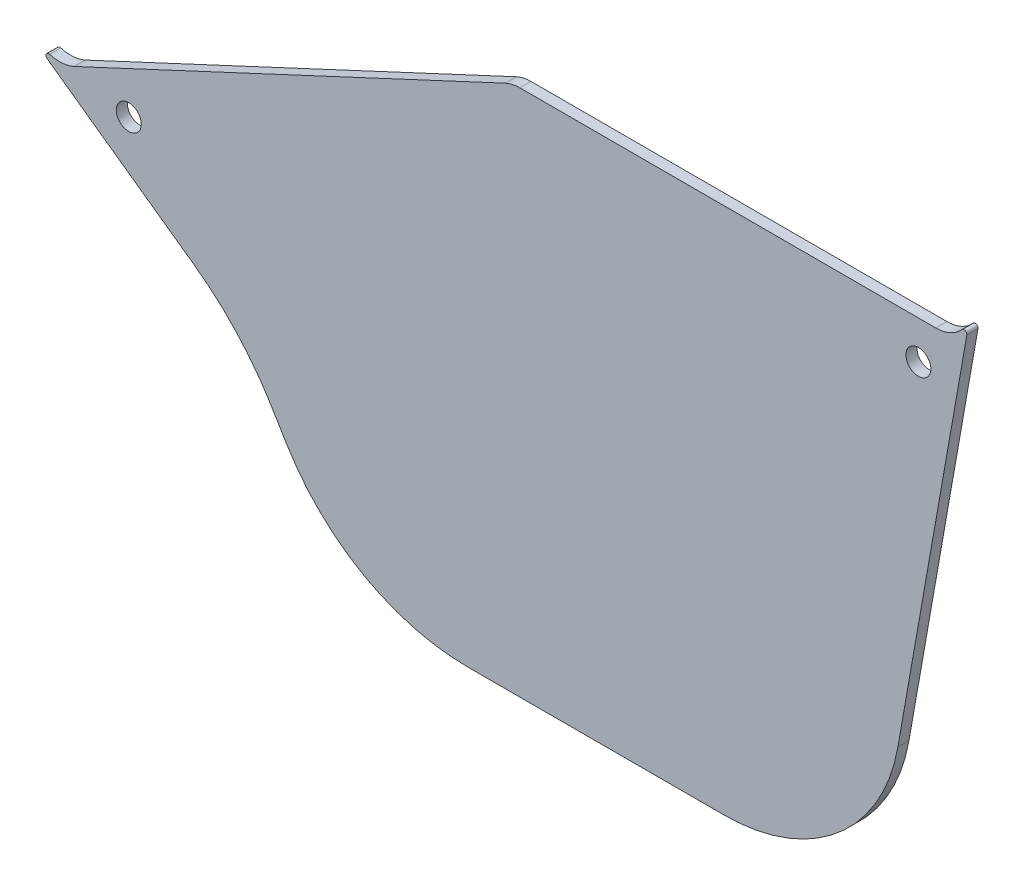
ISO-10303-21;
HEADER;
FILE_DESCRIPTION(('STEP AP214'),'2;1');
FILE_NAME('part.step','',(''),(''),'','','');
FILE_SCHEMA(('AUTOMOTIVE_DESIGN { 1 0 10303 214 1 1 1 1 }'));
ENDSEC;
DATA;
#1=APPLICATION_CONTEXT('core data for automotive mechanical design processes');
#2=APPLICATION_PROTOCOL_DEFINITION('international standard','automotive_design',2000,#1);
#3=PRODUCT_CONTEXT('',#1,'mechanical');
#4=PRODUCT('Part','Part','',(#3));
#5=PRODUCT_RELATED_PRODUCT_CATEGORY('part','',(#4));
#6=PRODUCT_DEFINITION_FORMATION('','',#4);
#7=PRODUCT_DEFINITION_CONTEXT('part definition',#1,'design');
#8=PRODUCT_DEFINITION('design','',#6,#7);
#9=PRODUCT_DEFINITION_SHAPE('','',#8);
#10=(LENGTH_UNIT() NAMED_UNIT(*) SI_UNIT(.MILLI.,.METRE.));
#11=(NAMED_UNIT(*) PLANE_ANGLE_UNIT() SI_UNIT($,.RADIAN.));
#12=(NAMED_UNIT(*) SI_UNIT($,.STERADIAN.) SOLID_ANGLE_UNIT());
#13=UNCERTAINTY_MEASURE_WITH_UNIT(LENGTH_MEASURE(1.E-05),#10,'distance_accuracy_value','');
#14=(GEOMETRIC_REPRESENTATION_CONTEXT(3) GLOBAL_UNCERTAINTY_ASSIGNED_CONTEXT((#13)) GLOBAL_UNIT_ASSIGNED_CONTEXT((#10,
#11,#12)) REPRESENTATION_CONTEXT('',''));
#15=CARTESIAN_POINT('',(0.,0.,0.));
#16=DIRECTION('',(0.,0.,1.));
#17=DIRECTION('',(1.,0.,0.));
#18=AXIS2_PLACEMENT_3D('',#15,#16,#17);
#19=CARTESIAN_POINT('',(3.17555102702063,-3.48237513143359,-2.3));
#20=DIRECTION('',(0.,0.,-1.));
#21=DIRECTION('',(-1.,0.,0.));
#22=AXIS2_PLACEMENT_3D('',#19,#20,#21);
#23=CYLINDRICAL_SURFACE('',#22,6.29662486856644);
#24=CARTESIAN_POINT('',(3.17555102702063,-3.48237513143359,-2.3));
#25=DIRECTION('',(0.,0.,1.));
#26=DIRECTION('',(1.,0.,0.));
#27=AXIS2_PLACEMENT_3D('',#24,#25,#26);
#28=CIRCLE('',#27,6.29662486856644);
#29=CARTESIAN_POINT('',(3.17555102702063,-9.77900000000003,-2.3));
#30=VERTEX_POINT('',#29);
#31=CARTESIAN_POINT('',(7.87588451477191,-7.6721662765115,-2.3));
#32=VERTEX_POINT('',#31);
#33=EDGE_CURVE('E147',#30,#32,#28,.T.);
#34=ORIENTED_EDGE('',*,*,#33,.T.);
#35=DIRECTION('',(0.,0.,-1.));
#36=VECTOR('',#35,1.);
#37=CARTESIAN_POINT('',(7.87588451477191,-7.6721662765115,-2.3));
#38=LINE('',#37,#36);
#39=CARTESIAN_POINT('',(7.87588451477191,-7.6721662765115,-4.3));
#40=VERTEX_POINT('',#39);
#41=EDGE_CURVE('E46',#32,#40,#38,.T.);
#42=ORIENTED_EDGE('',*,*,#41,.T.);
#43=CARTESIAN_POINT('',(3.17555102702063,-3.48237513143359,-4.3));
#44=DIRECTION('',(0.,0.,1.));
#45=DIRECTION('',(1.,0.,0.));
#46=AXIS2_PLACEMENT_3D('',#43,#44,#45);
#47=CIRCLE('',#46,6.29662486856644);
#48=CARTESIAN_POINT('',(3.17555102702063,-9.77900000000003,-4.3));
#49=VERTEX_POINT('',#48);
#50=EDGE_CURVE('E150',#49,#40,#47,.T.);
#51=ORIENTED_EDGE('',*,*,#50,.F.);
#52=DIRECTION('',(0.,0.,-1.));
#53=VECTOR('',#52,1.);
#54=CARTESIAN_POINT('',(3.17555102702063,-9.77900000000003,-2.3));
#55=LINE('',#54,#53);
#56=EDGE_CURVE('E145',#30,#49,#55,.T.);
#57=ORIENTED_EDGE('',*,*,#56,.F.);
#58=EDGE_LOOP('',(#34,#42,#51,#57));
#59=FACE_BOUND('',#58,.T.);
#60=ADVANCED_FACE('F38',(#59),#23,.F.);
#61=CARTESIAN_POINT('',(0.,-9.77900000000003,-2.3));
#62=DIRECTION('',(0.,1.,0.));
#63=DIRECTION('',(0.,0.,1.));
#64=AXIS2_PLACEMENT_3D('',#61,#62,#63);
#65=PLANE('',#64);
#66=DIRECTION('',(1.,0.,0.));
#67=VECTOR('',#66,1.);
#68=CARTESIAN_POINT('',(0.,-9.77900000000003,-4.3));
#69=LINE('',#68,#67);
#70=CARTESIAN_POINT('',(-71.7349422918853,-9.77900000000003,-4.3));
#71=VERTEX_POINT('',#70);
#72=EDGE_CURVE('E200',#71,#49,#69,.T.);
#73=ORIENTED_EDGE('',*,*,#72,.F.);
#74=DIRECTION('',(0.,0.,-1.));
#75=VECTOR('',#74,1.);
#76=CARTESIAN_POINT('',(-71.7349422918853,-9.77900000000003,-2.3));
#77=LINE('',#76,#75);
#78=CARTESIAN_POINT('',(-71.7349422918853,-9.77900000000003,-2.3));
#79=VERTEX_POINT('',#78);
#80=EDGE_CURVE('E156',#79,#71,#77,.T.);
#81=ORIENTED_EDGE('',*,*,#80,.F.);
#82=DIRECTION('',(1.,0.,0.));
#83=VECTOR('',#82,1.);
#84=CARTESIAN_POINT('',(0.,-9.77900000000003,-2.3));
#85=LINE('',#84,#83);
#86=EDGE_CURVE('E162',#79,#30,#85,.T.);
#87=ORIENTED_EDGE('',*,*,#86,.T.);
#88=ORIENTED_EDGE('',*,*,#56,.T.);
#89=EDGE_LOOP('',(#73,#81,#87,#88));
#90=FACE_BOUND('',#89,.T.);
#91=ADVANCED_FACE('F165',(#90),#65,.T.);
#92=CARTESIAN_POINT('',(-71.7349422918853,-15.875,-2.3));
#93=DIRECTION('',(0.,0.,-1.));
#94=DIRECTION('',(-1.,0.,0.));
#95=AXIS2_PLACEMENT_3D('',#92,#93,#94);
#96=CYLINDRICAL_SURFACE('',#95,6.096);
#97=CARTESIAN_POINT('',(-71.7349422918853,-15.875,-4.3));
#98=DIRECTION('',(0.,0.,1.));
#99=DIRECTION('',(1.,0.,0.));
#100=AXIS2_PLACEMENT_3D('',#97,#98,#99);
#101=CIRCLE('',#100,6.096);
#102=CARTESIAN_POINT('',(-74.3118353761856,-10.3504332267511,-4.3));
#103=VERTEX_POINT('',#102);
#104=EDGE_CURVE('E202',#71,#103,#101,.T.);
#105=ORIENTED_EDGE('',*,*,#104,.T.);
#106=DIRECTION('',(0.,0.,-1.));
#107=VECTOR('',#106,1.);
#108=CARTESIAN_POINT('',(-74.3118353761856,-10.3504332267511,-2.3));
#109=LINE('',#108,#107);
#110=CARTESIAN_POINT('',(-74.3118353761856,-10.3504332267511,-2.3));
#111=VERTEX_POINT('',#110);
#112=EDGE_CURVE('E254',#111,#103,#109,.T.);
#113=ORIENTED_EDGE('',*,*,#112,.F.);
#114=CARTESIAN_POINT('',(-71.7349422918853,-15.875,-2.3));
#115=DIRECTION('',(0.,0.,1.));
#116=DIRECTION('',(1.,0.,0.));
#117=AXIS2_PLACEMENT_3D('',#114,#115,#116);
#118=CIRCLE('',#117,6.096);
#119=EDGE_CURVE('E167',#79,#111,#118,.T.);
#120=ORIENTED_EDGE('',*,*,#119,.F.);
#121=ORIENTED_EDGE('',*,*,#80,.T.);
#122=EDGE_LOOP('',(#105,#113,#120,#121));
#123=FACE_BOUND('',#122,.T.);
#124=ADVANCED_FACE('F277',(#123),#96,.T.);
#125=CARTESIAN_POINT('',(-9.3136793879501,19.9674732323381,-2.3));
#126=DIRECTION('',(-0.422718681807782,0.906260953616943,0.));
#127=DIRECTION('',(-0.906260953616943,-0.422718681807782,0.));
#128=AXIS2_PLACEMENT_3D('',#125,#126,#127);
#129=PLANE('',#128);
#130=DIRECTION('',(0.906260953616943,0.422718681807782,0.));
#131=VECTOR('',#130,1.);
#132=CARTESIAN_POINT('',(-9.3136793879501,19.9674732323381,-4.3));
#133=LINE('',#132,#131);
#134=CARTESIAN_POINT('',(-151.921287836726,-46.5507851331294,-4.3));
#135=VERTEX_POINT('',#134);
#136=EDGE_CURVE('E205',#135,#103,#133,.T.);
#137=ORIENTED_EDGE('',*,*,#136,.F.);
#138=DIRECTION('',(0.,0.,-1.));
#139=VECTOR('',#138,1.);
#140=CARTESIAN_POINT('',(-151.921287836726,-46.5507851331294,-2.3));
#141=LINE('',#140,#139);
#142=CARTESIAN_POINT('',(-151.921287836726,-46.5507851331294,-2.3));
#143=VERTEX_POINT('',#142);
#144=EDGE_CURVE('E251',#143,#135,#141,.T.);
#145=ORIENTED_EDGE('',*,*,#144,.F.);
#146=DIRECTION('',(0.906260953616943,0.422718681807782,0.));
#147=VECTOR('',#146,1.);
#148=CARTESIAN_POINT('',(-9.3136793879501,19.9674732323381,-2.3));
#149=LINE('',#148,#147);
#150=EDGE_CURVE('E169',#143,#111,#149,.T.);
#151=ORIENTED_EDGE('',*,*,#150,.T.);
#152=ORIENTED_EDGE('',*,*,#112,.T.);
#153=EDGE_LOOP('',(#137,#145,#151,#152));
#154=FACE_BOUND('',#153,.T.);
#155=ADVANCED_FACE('F282',(#154),#129,.T.);
#156=CARTESIAN_POINT('',(-154.579277370173,-40.8523567623182,-2.3));
#157=DIRECTION('',(0.,0.,-1.));
#158=DIRECTION('',(-1.,0.,0.));
#159=AXIS2_PLACEMENT_3D('',#156,#157,#158);
#160=CYLINDRICAL_SURFACE('',#159,6.28784496128673);
#161=CARTESIAN_POINT('',(-154.579277370173,-40.8523567623182,-4.3));
#162=DIRECTION('',(0.,0.,1.));
#163=DIRECTION('',(1.,0.,0.));
#164=AXIS2_PLACEMENT_3D('',#161,#162,#163);
#165=CIRCLE('',#164,6.28784496128673);
#166=CARTESIAN_POINT('',(-156.37458568513,-46.8784551942577,-4.3));
#167=VERTEX_POINT('',#166);
#168=EDGE_CURVE('E208',#167,#135,#165,.T.);
#169=ORIENTED_EDGE('',*,*,#168,.F.);
#170=DIRECTION('',(0.,0.,-1.));
#171=VECTOR('',#170,1.);
#172=CARTESIAN_POINT('',(-156.37458568513,-46.8784551942577,-2.3));
#173=LINE('',#172,#171);
#174=CARTESIAN_POINT('',(-156.37458568513,-46.8784551942577,-2.3));
#175=VERTEX_POINT('',#174);
#176=EDGE_CURVE('E263',#167,#175,#173,.F.);
#177=ORIENTED_EDGE('',*,*,#176,.T.);
#178=CARTESIAN_POINT('',(-154.579277370173,-40.8523567623182,-2.3));
#179=DIRECTION('',(0.,0.,1.));
#180=DIRECTION('',(1.,0.,0.));
#181=AXIS2_PLACEMENT_3D('',#178,#179,#180);
#182=CIRCLE('',#181,6.28784496128673);
#183=EDGE_CURVE('E174',#175,#143,#182,.T.);
#184=ORIENTED_EDGE('',*,*,#183,.T.);
#185=ORIENTED_EDGE('',*,*,#144,.T.);
#186=EDGE_LOOP('',(#169,#177,#184,#185));
#187=FACE_BOUND('',#186,.T.);
#188=ADVANCED_FACE('F285',(#187),#160,.F.);
#189=CARTESIAN_POINT('',(-148.894628576094,-37.8519380941255,-2.3));
#190=DIRECTION('',(0.,0.,-1.));
#191=DIRECTION('',(-1.,0.,0.));
#192=AXIS2_PLACEMENT_3D('',#189,#190,#191);
#193=CYLINDRICAL_SURFACE('',#192,12.7);
#194=CARTESIAN_POINT('',(-148.894628576094,-37.8519380941255,-2.3));
#195=DIRECTION('',(0.,0.,1.));
#196=DIRECTION('',(1.,0.,0.));
#197=AXIS2_PLACEMENT_3D('',#194,#195,#196);
#198=CIRCLE('',#197,12.7);
#199=CARTESIAN_POINT('',(-156.837338468798,-47.761698916685,-2.3));
#200=VERTEX_POINT('',#199);
#201=CARTESIAN_POINT('',(-156.273248148591,-48.188570679468,-2.3));
#202=VERTEX_POINT('',#201);
#203=EDGE_CURVE('E176',#200,#202,#198,.T.);
#204=ORIENTED_EDGE('',*,*,#203,.F.);
#205=DIRECTION('',(0.,0.,-1.));
#206=VECTOR('',#205,1.);
#207=CARTESIAN_POINT('',(-156.837338468798,-47.761698916685,-2.3));
#208=LINE('',#207,#206);
#209=CARTESIAN_POINT('',(-156.837338468798,-47.761698916685,-4.3));
#210=VERTEX_POINT('',#209);
#211=EDGE_CURVE('E155',#200,#210,#208,.T.);
#212=ORIENTED_EDGE('',*,*,#211,.T.);
#213=CARTESIAN_POINT('',(-148.894628576094,-37.8519380941255,-4.3));
#214=DIRECTION('',(0.,0.,1.));
#215=DIRECTION('',(1.,0.,0.));
#216=AXIS2_PLACEMENT_3D('',#213,#214,#215);
#217=CIRCLE('',#216,12.7);
#218=CARTESIAN_POINT('',(-156.273248148591,-48.188570679468,-4.3));
#219=VERTEX_POINT('',#218);
#220=EDGE_CURVE('E210',#210,#219,#217,.T.);
#221=ORIENTED_EDGE('',*,*,#220,.T.);
#222=DIRECTION('',(0.,0.,-1.));
#223=VECTOR('',#222,1.);
#224=CARTESIAN_POINT('',(-156.273248148591,-48.188570679468,-2.3));
#225=LINE('',#224,#223);
#226=EDGE_CURVE('E248',#202,#219,#225,.T.);
#227=ORIENTED_EDGE('',*,*,#226,.F.);
#228=EDGE_LOOP('',(#204,#212,#221,#227));
#229=FACE_BOUND('',#228,.T.);
#230=ADVANCED_FACE('F293',(#229),#193,.T.);
#231=CARTESIAN_POINT('',(-75.5377954413739,-105.820123955786,-2.3));
#232=DIRECTION('',(0.580993667125757,0.813908077586016,0.));
#233=DIRECTION('',(-0.813908077586016,0.580993667125757,0.));
#234=AXIS2_PLACEMENT_3D('',#231,#232,#233);
#235=PLANE('',#234);
#236=DIRECTION('',(0.813908077586016,-0.580993667125757,0.));
#237=VECTOR('',#236,1.);
#238=CARTESIAN_POINT('',(-75.5377954413739,-105.820123955786,-4.3));
#239=LINE('',#238,#237);
#240=CARTESIAN_POINT('',(-130.476004778937,-66.6034696586304,-4.3));
#241=VERTEX_POINT('',#240);
#242=EDGE_CURVE('E212',#219,#241,#239,.T.);
#243=ORIENTED_EDGE('',*,*,#242,.T.);
#244=DIRECTION('',(0.,0.,-1.));
#245=VECTOR('',#244,1.);
#246=CARTESIAN_POINT('',(-130.476004778937,-66.6034696586304,-2.3));
#247=LINE('',#246,#245);
#248=CARTESIAN_POINT('',(-130.476004778937,-66.6034696586304,-2.3));
#249=VERTEX_POINT('',#248);
#250=EDGE_CURVE('E245',#249,#241,#247,.T.);
#251=ORIENTED_EDGE('',*,*,#250,.F.);
#252=DIRECTION('',(0.813908077586016,-0.580993667125757,0.));
#253=VECTOR('',#252,1.);
#254=CARTESIAN_POINT('',(-75.5377954413739,-105.820123955786,-2.3));
#255=LINE('',#254,#253);
#256=EDGE_CURVE('E178',#202,#249,#255,.T.);
#257=ORIENTED_EDGE('',*,*,#256,.F.);
#258=ORIENTED_EDGE('',*,*,#226,.T.);
#259=EDGE_LOOP('',(#243,#251,#257,#258));
#260=FACE_BOUND('',#259,.T.);
#261=ADVANCED_FACE('F298',(#260),#235,.F.);
#262=CARTESIAN_POINT('',(-159.990483068926,-107.95,-2.3));
#263=DIRECTION('',(0.,0.,-1.));
#264=DIRECTION('',(-1.,0.,0.));
#265=AXIS2_PLACEMENT_3D('',#262,#263,#264);
#266=CYLINDRICAL_SURFACE('',#265,50.8);
#267=CARTESIAN_POINT('',(-159.990483068926,-107.95,-4.3));
#268=DIRECTION('',(0.,0.,1.));
#269=DIRECTION('',(1.,0.,0.));
#270=AXIS2_PLACEMENT_3D('',#267,#268,#269);
#271=CIRCLE('',#270,50.8);
#272=CARTESIAN_POINT('',(-116.540360393734,-81.6302956036583,-4.3));
#273=VERTEX_POINT('',#272);
#274=EDGE_CURVE('E214',#241,#273,#271,.F.);
#275=ORIENTED_EDGE('',*,*,#274,.T.);
#276=DIRECTION('',(0.,0.,-1.));
#277=VECTOR('',#276,1.);
#278=CARTESIAN_POINT('',(-116.540360393734,-81.6302956036583,-2.3));
#279=LINE('',#278,#277);
#280=CARTESIAN_POINT('',(-116.540360393734,-81.6302956036583,-2.3));
#281=VERTEX_POINT('',#280);
#282=EDGE_CURVE('E242',#281,#273,#279,.T.);
#283=ORIENTED_EDGE('',*,*,#282,.F.);
#284=CARTESIAN_POINT('',(-159.990483068926,-107.95,-2.3));
#285=DIRECTION('',(0.,0.,1.));
#286=DIRECTION('',(1.,0.,0.));
#287=AXIS2_PLACEMENT_3D('',#284,#285,#286);
#288=CIRCLE('',#287,50.8);
#289=EDGE_CURVE('E180',#249,#281,#288,.F.);
#290=ORIENTED_EDGE('',*,*,#289,.F.);
#291=ORIENTED_EDGE('',*,*,#250,.T.);
#292=EDGE_LOOP('',(#275,#283,#290,#291));
#293=FACE_BOUND('',#292,.T.);
#294=ADVANCED_FACE('F304',(#293),#266,.F.);
#295=CARTESIAN_POINT('',(-121.431128633614,-73.55632650436,-2.3));
#296=DIRECTION('',(0.855317375495895,0.518104417250822,0.));
#297=DIRECTION('',(-0.518104417250822,0.855317375495895,0.));
#298=AXIS2_PLACEMENT_3D('',#295,#296,#297);
#299=PLANE('',#298);
#300=DIRECTION('',(0.518104417250822,-0.855317375495895,0.));
#301=VECTOR('',#300,1.);
#302=CARTESIAN_POINT('',(-121.431128633614,-73.55632650436,-4.3));
#303=LINE('',#302,#301);
#304=CARTESIAN_POINT('',(-113.642182841365,-86.4147782972563,-4.3));
#305=VERTEX_POINT('',#304);
#306=EDGE_CURVE('E216',#273,#305,#303,.T.);
#307=ORIENTED_EDGE('',*,*,#306,.T.);
#308=DIRECTION('',(0.,0.,-1.));
#309=VECTOR('',#308,1.);
#310=CARTESIAN_POINT('',(-113.642182841365,-86.4147782972563,-2.3));
#311=LINE('',#310,#309);
#312=CARTESIAN_POINT('',(-113.642182841365,-86.4147782972563,-2.3));
#313=VERTEX_POINT('',#312);
#314=EDGE_CURVE('E239',#313,#305,#311,.T.);
#315=ORIENTED_EDGE('',*,*,#314,.F.);
#316=DIRECTION('',(0.518104417250822,-0.855317375495895,0.));
#317=VECTOR('',#316,1.);
#318=CARTESIAN_POINT('',(-121.431128633614,-73.55632650436,-2.3));
#319=LINE('',#318,#317);
#320=EDGE_CURVE('E182',#281,#313,#319,.T.);
#321=ORIENTED_EDGE('',*,*,#320,.F.);
#322=ORIENTED_EDGE('',*,*,#282,.T.);
#323=EDGE_LOOP('',(#307,#315,#321,#322));
#324=FACE_BOUND('',#323,.T.);
#325=ADVANCED_FACE('F308',(#324),#299,.F.);
#326=CARTESIAN_POINT('',(-81.0545908349717,-66.675,-2.3));
#327=DIRECTION('',(0.,0.,-1.));
#328=DIRECTION('',(-1.,0.,0.));
#329=AXIS2_PLACEMENT_3D('',#326,#327,#328);
#330=CYLINDRICAL_SURFACE('',#329,38.1);
#331=CARTESIAN_POINT('',(-81.0545908349717,-66.675,-4.3));
#332=DIRECTION('',(0.,0.,1.));
#333=DIRECTION('',(1.,0.,0.));
#334=AXIS2_PLACEMENT_3D('',#331,#332,#333);
#335=CIRCLE('',#334,38.1);
#336=CARTESIAN_POINT('',(-81.0545908349717,-104.775,-4.3));
#337=VERTEX_POINT('',#336);
#338=EDGE_CURVE('E218',#305,#337,#335,.T.);
#339=ORIENTED_EDGE('',*,*,#338,.T.);
#340=DIRECTION('',(0.,0.,-1.));
#341=VECTOR('',#340,1.);
#342=CARTESIAN_POINT('',(-81.0545908349717,-104.775,-2.3));
#343=LINE('',#342,#341);
#344=CARTESIAN_POINT('',(-81.0545908349717,-104.775,-2.3));
#345=VERTEX_POINT('',#344);
#346=EDGE_CURVE('E236',#345,#337,#343,.T.);
#347=ORIENTED_EDGE('',*,*,#346,.F.);
#348=CARTESIAN_POINT('',(-81.0545908349717,-66.675,-2.3));
#349=DIRECTION('',(0.,0.,1.));
#350=DIRECTION('',(1.,0.,0.));
#351=AXIS2_PLACEMENT_3D('',#348,#349,#350);
#352=CIRCLE('',#351,38.1);
#353=EDGE_CURVE('E184',#313,#345,#352,.T.);
#354=ORIENTED_EDGE('',*,*,#353,.F.);
#355=ORIENTED_EDGE('',*,*,#314,.T.);
#356=EDGE_LOOP('',(#339,#347,#354,#355));
#357=FACE_BOUND('',#356,.T.);
#358=ADVANCED_FACE('F313',(#357),#330,.T.);
#359=CARTESIAN_POINT('',(0.,-104.775,-2.3));
#360=DIRECTION('',(0.,1.,0.));
#361=DIRECTION('',(0.,0.,1.));
#362=AXIS2_PLACEMENT_3D('',#359,#360,#361);
#363=PLANE('',#362);
#364=DIRECTION('',(1.,0.,0.));
#365=VECTOR('',#364,1.);
#366=CARTESIAN_POINT('',(0.,-104.775,-4.3));
#367=LINE('',#366,#365);
#368=CARTESIAN_POINT('',(-34.932724517363,-104.775,-4.3));
#369=VERTEX_POINT('',#368);
#370=EDGE_CURVE('E220',#337,#369,#367,.T.);
#371=ORIENTED_EDGE('',*,*,#370,.T.);
#372=DIRECTION('',(0.,0.,-1.));
#373=VECTOR('',#372,1.);
#374=CARTESIAN_POINT('',(-34.932724517363,-104.775,-2.3));
#375=LINE('',#374,#373);
#376=CARTESIAN_POINT('',(-34.932724517363,-104.775,-2.3));
#377=VERTEX_POINT('',#376);
#378=EDGE_CURVE('E233',#377,#369,#375,.T.);
#379=ORIENTED_EDGE('',*,*,#378,.F.);
#380=DIRECTION('',(1.,0.,0.));
#381=VECTOR('',#380,1.);
#382=CARTESIAN_POINT('',(0.,-104.775,-2.3));
#383=LINE('',#382,#381);
#384=EDGE_CURVE('E186',#345,#377,#383,.T.);
#385=ORIENTED_EDGE('',*,*,#384,.F.);
#386=ORIENTED_EDGE('',*,*,#346,.T.);
#387=EDGE_LOOP('',(#371,#379,#385,#386));
#388=FACE_BOUND('',#387,.T.);
#389=ADVANCED_FACE('F319',(#388),#363,.F.);
#390=CARTESIAN_POINT('',(-34.932724517363,-73.025,-2.3));
#391=DIRECTION('',(0.,0.,-1.));
#392=DIRECTION('',(-1.,0.,0.));
#393=AXIS2_PLACEMENT_3D('',#390,#391,#392);
#394=CYLINDRICAL_SURFACE('',#393,31.75);
#395=CARTESIAN_POINT('',(-34.932724517363,-73.025,-4.3));
#396=DIRECTION('',(0.,0.,1.));
#397=DIRECTION('',(1.,0.,0.));
#398=AXIS2_PLACEMENT_3D('',#395,#396,#397);
#399=CIRCLE('',#398,31.75);
#400=CARTESIAN_POINT('',(-3.66507835922539,-78.5383296409249,-4.3));
#401=VERTEX_POINT('',#400);
#402=EDGE_CURVE('E222',#369,#401,#399,.T.);
#403=ORIENTED_EDGE('',*,*,#402,.T.);
#404=DIRECTION('',(0.,0.,-1.));
#405=VECTOR('',#404,1.);
#406=CARTESIAN_POINT('',(-3.66507835922539,-78.5383296409249,-2.3));
#407=LINE('',#406,#405);
#408=CARTESIAN_POINT('',(-3.66507835922539,-78.5383296409249,-2.3));
#409=VERTEX_POINT('',#408);
#410=EDGE_CURVE('E198',#409,#401,#407,.T.);
#411=ORIENTED_EDGE('',*,*,#410,.F.);
#412=CARTESIAN_POINT('',(-34.932724517363,-73.025,-2.3));
#413=DIRECTION('',(0.,0.,1.));
#414=DIRECTION('',(1.,0.,0.));
#415=AXIS2_PLACEMENT_3D('',#412,#413,#414);
#416=CIRCLE('',#415,31.75);
#417=EDGE_CURVE('E188',#377,#409,#416,.T.);
#418=ORIENTED_EDGE('',*,*,#417,.F.);
#419=ORIENTED_EDGE('',*,*,#378,.T.);
#420=EDGE_LOOP('',(#403,#411,#418,#419));
#421=FACE_BOUND('',#420,.T.);
#422=ADVANCED_FACE('F323',(#421),#394,.T.);
#423=CARTESIAN_POINT('',(0.0280821344664367,-16.637,-2.3));
#424=DIRECTION('',(0.,0.,-1.));
#425=DIRECTION('',(-1.,0.,0.));
#426=AXIS2_PLACEMENT_3D('',#423,#424,#425);
#427=CYLINDRICAL_SURFACE('',#426,2.2479);
#428=CARTESIAN_POINT('',(0.0280821344664367,-16.637,-2.3));
#429=DIRECTION('',(0.,0.,1.));
#430=DIRECTION('',(1.,0.,0.));
#431=AXIS2_PLACEMENT_3D('',#428,#429,#430);
#432=CIRCLE('',#431,2.2479);
#433=CARTESIAN_POINT('',(2.27598213446644,-16.637,-2.3));
#434=VERTEX_POINT('',#433);
#435=EDGE_CURVE('E192',#434,#434,#432,.F.);
#436=ORIENTED_EDGE('',*,*,#435,.F.);
#437=EDGE_LOOP('',(#436));
#438=FACE_BOUND('',#437,.T.);
#439=CARTESIAN_POINT('',(0.0280821344664367,-16.637,-4.3));
#440=DIRECTION('',(0.,0.,1.));
#441=DIRECTION('',(1.,0.,0.));
#442=AXIS2_PLACEMENT_3D('',#439,#440,#441);
#443=CIRCLE('',#442,2.2479);
#444=CARTESIAN_POINT('',(2.27598213446644,-16.637,-4.3));
#445=VERTEX_POINT('',#444);
#446=EDGE_CURVE('E226',#445,#445,#443,.F.);
#447=ORIENTED_EDGE('',*,*,#446,.T.);
#448=EDGE_LOOP('',(#447));
#449=FACE_BOUND('',#448,.T.);
#450=ADVANCED_FACE('F356',(#438,#449),#427,.F.);
#451=CARTESIAN_POINT('',(9.87628265617754,-1.74145510138709,-2.3));
#452=DIRECTION('',(-0.984807753012209,0.173648177666924,0.));
#453=DIRECTION('',(-0.173648177666924,-0.984807753012209,0.));
#454=AXIS2_PLACEMENT_3D('',#451,#452,#453);
#455=PLANE('',#454);
#456=DIRECTION('',(0.173648177666924,0.984807753012209,0.));
#457=VECTOR('',#456,1.);
#458=CARTESIAN_POINT('',(9.87628265617754,-1.74145510138709,-4.3));
#459=LINE('',#458,#457);
#460=CARTESIAN_POINT('',(8.75538102940742,-8.09840411886863,-4.3));
#461=VERTEX_POINT('',#460);
#462=EDGE_CURVE('E224',#401,#461,#459,.T.);
#463=ORIENTED_EDGE('',*,*,#462,.T.);
#464=DIRECTION('',(0.,0.,1.));
#465=VECTOR('',#464,1.);
#466=CARTESIAN_POINT('',(8.75538102940742,-8.09840411886863,-2.3));
#467=LINE('',#466,#465);
#468=CARTESIAN_POINT('',(8.75538102940742,-8.09840411886863,-2.3));
#469=VERTEX_POINT('',#468);
#470=EDGE_CURVE('E11',#461,#469,#467,.T.);
#471=ORIENTED_EDGE('',*,*,#470,.T.);
#472=DIRECTION('',(0.173648177666924,0.984807753012209,0.));
#473=VECTOR('',#472,1.);
#474=CARTESIAN_POINT('',(9.87628265617754,-1.74145510138709,-2.3));
#475=LINE('',#474,#473);
#476=EDGE_CURVE('E190',#409,#469,#475,.T.);
#477=ORIENTED_EDGE('',*,*,#476,.F.);
#478=ORIENTED_EDGE('',*,*,#410,.T.);
#479=EDGE_LOOP('',(#463,#471,#477,#478));
#480=FACE_BOUND('',#479,.T.);
#481=ADVANCED_FACE('F324',(#480),#455,.F.);
#482=CARTESIAN_POINT('',(-142.126033439112,-49.5492183793413,-2.3));
#483=DIRECTION('',(0.,0.,-1.));
#484=DIRECTION('',(-1.,0.,0.));
#485=AXIS2_PLACEMENT_3D('',#482,#483,#484);
#486=CYLINDRICAL_SURFACE('',#485,2.2479);
#487=CARTESIAN_POINT('',(-142.126033439112,-49.5492183793413,-2.3));
#488=DIRECTION('',(0.,0.,1.));
#489=DIRECTION('',(1.,0.,0.));
#490=AXIS2_PLACEMENT_3D('',#487,#488,#489);
#491=CIRCLE('',#490,2.2479);
#492=CARTESIAN_POINT('',(-139.878133439112,-49.5492183793413,-2.3));
#493=VERTEX_POINT('',#492);
#494=EDGE_CURVE('E195',#493,#493,#491,.F.);
#495=ORIENTED_EDGE('',*,*,#494,.F.);
#496=EDGE_LOOP('',(#495));
#497=FACE_BOUND('',#496,.T.);
#498=CARTESIAN_POINT('',(-142.126033439112,-49.5492183793413,-4.3));
#499=DIRECTION('',(0.,0.,1.));
#500=DIRECTION('',(1.,0.,0.));
#501=AXIS2_PLACEMENT_3D('',#498,#499,#500);
#502=CIRCLE('',#501,2.2479);
#503=CARTESIAN_POINT('',(-139.878133439112,-49.5492183793413,-4.3));
#504=VERTEX_POINT('',#503);
#505=EDGE_CURVE('E163',#504,#504,#502,.F.);
#506=ORIENTED_EDGE('',*,*,#505,.T.);
#507=EDGE_LOOP('',(#506));
#508=FACE_BOUND('',#507,.T.);
#509=ADVANCED_FACE('F359',(#497,#508),#486,.F.);
#510=CARTESIAN_POINT('',(0.,0.,-2.3));
#511=DIRECTION('',(0.,0.,1.));
#512=DIRECTION('',(1.,0.,0.));
#513=AXIS2_PLACEMENT_3D('',#510,#511,#512);
#514=PLANE('',#513);
#515=ORIENTED_EDGE('',*,*,#183,.F.);
#516=CARTESIAN_POINT('',(-156.51963007309,-47.3653084837826,-2.3));
#517=DIRECTION('',(0.,0.,1.));
#518=DIRECTION('',(1.,0.,0.));
#519=AXIS2_PLACEMENT_3D('',#516,#517,#518);
#520=CIRCLE('',#519,0.508);
#521=EDGE_CURVE('E266',#175,#200,#520,.T.);
#522=ORIENTED_EDGE('',*,*,#521,.T.);
#523=ORIENTED_EDGE('',*,*,#203,.T.);
#524=ORIENTED_EDGE('',*,*,#256,.T.);
#525=ORIENTED_EDGE('',*,*,#289,.T.);
#526=ORIENTED_EDGE('',*,*,#320,.T.);
#527=ORIENTED_EDGE('',*,*,#353,.T.);
#528=ORIENTED_EDGE('',*,*,#384,.T.);
#529=ORIENTED_EDGE('',*,*,#417,.T.);
#530=ORIENTED_EDGE('',*,*,#476,.T.);
#531=CARTESIAN_POINT('',(8.25509869087722,-8.01019084461383,-2.3));
#532=DIRECTION('',(0.,0.,1.));
#533=DIRECTION('',(1.,0.,0.));
#534=AXIS2_PLACEMENT_3D('',#531,#532,#533);
#535=CIRCLE('',#534,0.508);
#536=EDGE_CURVE('E58',#469,#32,#535,.T.);
#537=ORIENTED_EDGE('',*,*,#536,.T.);
#538=ORIENTED_EDGE('',*,*,#33,.F.);
#539=ORIENTED_EDGE('',*,*,#86,.F.);
#540=ORIENTED_EDGE('',*,*,#119,.T.);
#541=ORIENTED_EDGE('',*,*,#150,.F.);
#542=EDGE_LOOP('',(#515,#522,#523,#524,#525,#526,#527,#528,#529,#530,#537,#538,#539,#540,#541));
#543=FACE_BOUND('',#542,.T.);
#544=ORIENTED_EDGE('',*,*,#435,.T.);
#545=EDGE_LOOP('',(#544));
#546=FACE_BOUND('',#545,.T.);
#547=ORIENTED_EDGE('',*,*,#494,.T.);
#548=EDGE_LOOP('',(#547));
#549=FACE_BOUND('',#548,.T.);
#550=ADVANCED_FACE('F160',(#543,#546,#549),#514,.T.);
#551=CARTESIAN_POINT('',(0.,0.,-4.3));
#552=DIRECTION('',(0.,0.,1.));
#553=DIRECTION('',(1.,0.,0.));
#554=AXIS2_PLACEMENT_3D('',#551,#552,#553);
#555=PLANE('',#554);
#556=ORIENTED_EDGE('',*,*,#220,.F.);
#557=CARTESIAN_POINT('',(-156.51963007309,-47.3653084837826,-4.3));
#558=DIRECTION('',(0.,0.,1.));
#559=DIRECTION('',(1.,0.,0.));
#560=AXIS2_PLACEMENT_3D('',#557,#558,#559);
#561=CIRCLE('',#560,0.508);
#562=EDGE_CURVE('E261',#210,#167,#561,.F.);
#563=ORIENTED_EDGE('',*,*,#562,.T.);
#564=ORIENTED_EDGE('',*,*,#168,.T.);
#565=ORIENTED_EDGE('',*,*,#136,.T.);
#566=ORIENTED_EDGE('',*,*,#104,.F.);
#567=ORIENTED_EDGE('',*,*,#72,.T.);
#568=ORIENTED_EDGE('',*,*,#50,.T.);
#569=CARTESIAN_POINT('',(8.25509869087722,-8.01019084461383,-4.3));
#570=DIRECTION('',(0.,0.,1.));
#571=DIRECTION('',(1.,0.,0.));
#572=AXIS2_PLACEMENT_3D('',#569,#570,#571);
#573=CIRCLE('',#572,0.508);
#574=EDGE_CURVE('E259',#40,#461,#573,.F.);
#575=ORIENTED_EDGE('',*,*,#574,.T.);
#576=ORIENTED_EDGE('',*,*,#462,.F.);
#577=ORIENTED_EDGE('',*,*,#402,.F.);
#578=ORIENTED_EDGE('',*,*,#370,.F.);
#579=ORIENTED_EDGE('',*,*,#338,.F.);
#580=ORIENTED_EDGE('',*,*,#306,.F.);
#581=ORIENTED_EDGE('',*,*,#274,.F.);
#582=ORIENTED_EDGE('',*,*,#242,.F.);
#583=EDGE_LOOP('',(#556,#563,#564,#565,#566,#567,#568,#575,#576,#577,#578,#579,#580,#581,#582));
#584=FACE_BOUND('',#583,.T.);
#585=ORIENTED_EDGE('',*,*,#446,.F.);
#586=EDGE_LOOP('',(#585));
#587=FACE_BOUND('',#586,.T.);
#588=ORIENTED_EDGE('',*,*,#505,.F.);
#589=EDGE_LOOP('',(#588));
#590=FACE_BOUND('',#589,.T.);
#591=ADVANCED_FACE('F270',(#584,#587,#590),#555,.F.);
#592=CARTESIAN_POINT('',(-156.51963007309,-47.3653084837826,-2.3));
#593=DIRECTION('',(0.,0.,1.));
#594=DIRECTION('',(1.,0.,0.));
#595=AXIS2_PLACEMENT_3D('',#592,#593,#594);
#596=CYLINDRICAL_SURFACE('',#595,0.508);
#597=ORIENTED_EDGE('',*,*,#521,.F.);
#598=ORIENTED_EDGE('',*,*,#176,.F.);
#599=ORIENTED_EDGE('',*,*,#562,.F.);
#600=ORIENTED_EDGE('',*,*,#211,.F.);
#601=EDGE_LOOP('',(#597,#598,#599,#600));
#602=FACE_BOUND('',#601,.T.);
#603=ADVANCED_FACE('F288',(#602),#596,.T.);
#604=CARTESIAN_POINT('',(8.25509869087722,-8.01019084461383,-2.3));
#605=DIRECTION('',(0.,0.,-1.));
#606=DIRECTION('',(-1.,0.,0.));
#607=AXIS2_PLACEMENT_3D('',#604,#605,#606);
#608=CYLINDRICAL_SURFACE('',#607,0.508);
#609=ORIENTED_EDGE('',*,*,#536,.F.);
#610=ORIENTED_EDGE('',*,*,#470,.F.);
#611=ORIENTED_EDGE('',*,*,#574,.F.);
#612=ORIENTED_EDGE('',*,*,#41,.F.);
#613=EDGE_LOOP('',(#609,#610,#611,#612));
#614=FACE_BOUND('',#613,.T.);
#615=ADVANCED_FACE('F40',(#614),#608,.T.);
#616=CLOSED_SHELL('',(#60,#91,#124,#155,#188,#230,#261,#294,#325,#358,#389,#422,#450,#481,#509,
#550,#591,#603,#615));
#617=MANIFOLD_SOLID_BREP('B2',#616);
#618=ADVANCED_BREP_SHAPE_REPRESENTATION('',(#18,#617),#14);
#619=SHAPE_DEFINITION_REPRESENTATION(#9,#618);
ENDSEC;
END-ISO-10303-21;
